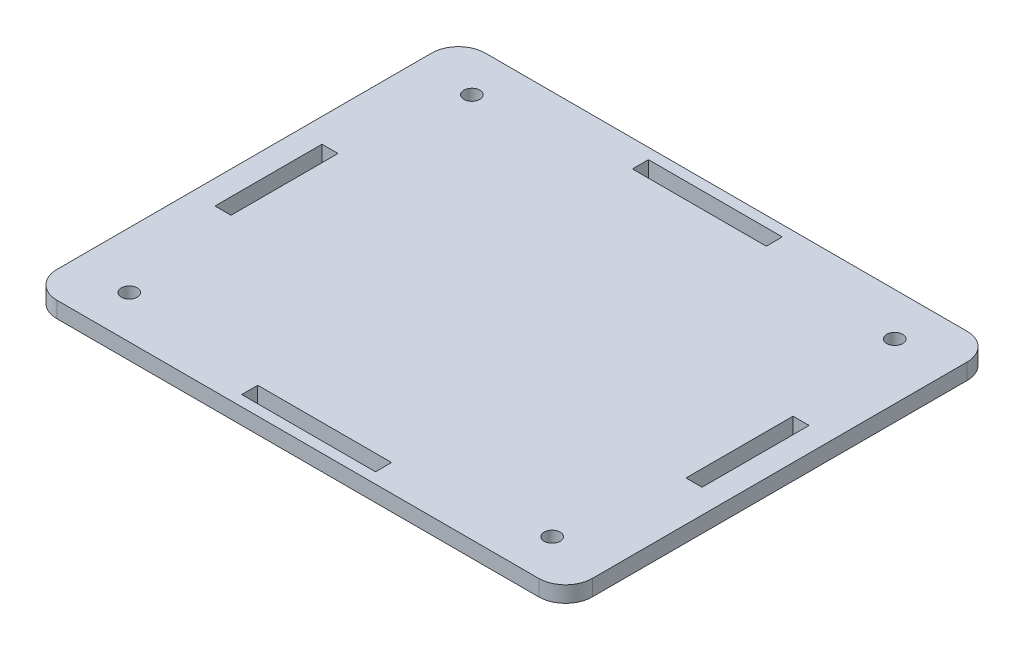
ISO-10303-21;
HEADER;
FILE_DESCRIPTION(('STEP AP214'),'2;1');
FILE_NAME('part.step','',(''),(''),'','','');
FILE_SCHEMA(('AUTOMOTIVE_DESIGN { 1 0 10303 214 1 1 1 1 }'));
ENDSEC;
DATA;
#1=APPLICATION_CONTEXT('core data for automotive mechanical design processes');
#2=APPLICATION_PROTOCOL_DEFINITION('international standard','automotive_design',2000,#1);
#3=PRODUCT_CONTEXT('',#1,'mechanical');
#4=PRODUCT('Part','Part','',(#3));
#5=PRODUCT_RELATED_PRODUCT_CATEGORY('part','',(#4));
#6=PRODUCT_DEFINITION_FORMATION('','',#4);
#7=PRODUCT_DEFINITION_CONTEXT('part definition',#1,'design');
#8=PRODUCT_DEFINITION('design','',#6,#7);
#9=PRODUCT_DEFINITION_SHAPE('','',#8);
#10=(LENGTH_UNIT() NAMED_UNIT(*) SI_UNIT(.MILLI.,.METRE.));
#11=(NAMED_UNIT(*) PLANE_ANGLE_UNIT() SI_UNIT($,.RADIAN.));
#12=(NAMED_UNIT(*) SI_UNIT($,.STERADIAN.) SOLID_ANGLE_UNIT());
#13=UNCERTAINTY_MEASURE_WITH_UNIT(LENGTH_MEASURE(1.E-05),#10,'distance_accuracy_value','');
#14=(GEOMETRIC_REPRESENTATION_CONTEXT(3) GLOBAL_UNCERTAINTY_ASSIGNED_CONTEXT((#13)) GLOBAL_UNIT_ASSIGNED_CONTEXT((#10,
#11,#12)) REPRESENTATION_CONTEXT('',''));
#15=CARTESIAN_POINT('',(0.,0.,0.));
#16=DIRECTION('',(0.,0.,1.));
#17=DIRECTION('',(1.,0.,0.));
#18=AXIS2_PLACEMENT_3D('',#15,#16,#17);
#19=CARTESIAN_POINT('',(50.,3.,-40.));
#20=DIRECTION('',(-1.,0.,0.));
#21=DIRECTION('',(0.,0.,1.));
#22=AXIS2_PLACEMENT_3D('',#19,#20,#21);
#23=PLANE('',#22);
#24=DIRECTION('',(0.,0.,-1.));
#25=VECTOR('',#24,1.);
#26=CARTESIAN_POINT('',(50.,3.,-40.));
#27=LINE('',#26,#25);
#28=CARTESIAN_POINT('',(50.,3.,35.));
#29=VERTEX_POINT('',#28);
#30=CARTESIAN_POINT('',(50.,3.,-35.));
#31=VERTEX_POINT('',#30);
#32=EDGE_CURVE('E307',#29,#31,#27,.T.);
#33=ORIENTED_EDGE('',*,*,#32,.F.);
#34=DIRECTION('',(0.,-1.,0.));
#35=VECTOR('',#34,1.);
#36=CARTESIAN_POINT('',(50.,3.,35.));
#37=LINE('',#36,#35);
#38=CARTESIAN_POINT('',(50.,0.,35.));
#39=VERTEX_POINT('',#38);
#40=EDGE_CURVE('E363',#29,#39,#37,.T.);
#41=ORIENTED_EDGE('',*,*,#40,.T.);
#42=DIRECTION('',(0.,0.,-1.));
#43=VECTOR('',#42,1.);
#44=CARTESIAN_POINT('',(50.,0.,-40.));
#45=LINE('',#44,#43);
#46=CARTESIAN_POINT('',(50.,0.,-35.));
#47=VERTEX_POINT('',#46);
#48=EDGE_CURVE('E304',#39,#47,#45,.T.);
#49=ORIENTED_EDGE('',*,*,#48,.T.);
#50=DIRECTION('',(0.,-1.,0.));
#51=VECTOR('',#50,1.);
#52=CARTESIAN_POINT('',(50.,3.,-35.));
#53=LINE('',#52,#51);
#54=EDGE_CURVE('E361',#47,#31,#53,.F.);
#55=ORIENTED_EDGE('',*,*,#54,.T.);
#56=EDGE_LOOP('',(#33,#41,#49,#55));
#57=FACE_BOUND('',#56,.T.);
#58=ADVANCED_FACE('F33',(#57),#23,.F.);
#59=CARTESIAN_POINT('',(-50.,3.,-40.));
#60=DIRECTION('',(0.,0.,1.));
#61=DIRECTION('',(1.,0.,0.));
#62=AXIS2_PLACEMENT_3D('',#59,#60,#61);
#63=PLANE('',#62);
#64=DIRECTION('',(-1.,0.,0.));
#65=VECTOR('',#64,1.);
#66=CARTESIAN_POINT('',(-50.,0.,-40.));
#67=LINE('',#66,#65);
#68=CARTESIAN_POINT('',(45.,0.,-40.));
#69=VERTEX_POINT('',#68);
#70=CARTESIAN_POINT('',(-45.,0.,-40.));
#71=VERTEX_POINT('',#70);
#72=EDGE_CURVE('E323',#69,#71,#67,.T.);
#73=ORIENTED_EDGE('',*,*,#72,.T.);
#74=DIRECTION('',(0.,-1.,0.));
#75=VECTOR('',#74,1.);
#76=CARTESIAN_POINT('',(-45.,3.,-40.));
#77=LINE('',#76,#75);
#78=CARTESIAN_POINT('',(-45.,3.,-40.));
#79=VERTEX_POINT('',#78);
#80=EDGE_CURVE('E346',#71,#79,#77,.F.);
#81=ORIENTED_EDGE('',*,*,#80,.T.);
#82=DIRECTION('',(-1.,0.,0.));
#83=VECTOR('',#82,1.);
#84=CARTESIAN_POINT('',(-50.,3.,-40.));
#85=LINE('',#84,#83);
#86=CARTESIAN_POINT('',(45.,3.,-40.));
#87=VERTEX_POINT('',#86);
#88=EDGE_CURVE('E310',#87,#79,#85,.T.);
#89=ORIENTED_EDGE('',*,*,#88,.F.);
#90=DIRECTION('',(0.,-1.,0.));
#91=VECTOR('',#90,1.);
#92=CARTESIAN_POINT('',(45.,3.,-40.));
#93=LINE('',#92,#91);
#94=EDGE_CURVE('E343',#87,#69,#93,.T.);
#95=ORIENTED_EDGE('',*,*,#94,.T.);
#96=EDGE_LOOP('',(#73,#81,#89,#95));
#97=FACE_BOUND('',#96,.T.);
#98=ADVANCED_FACE('F426',(#97),#63,.F.);
#99=CARTESIAN_POINT('',(-50.,3.,-40.));
#100=DIRECTION('',(1.,0.,0.));
#101=DIRECTION('',(0.,0.,-1.));
#102=AXIS2_PLACEMENT_3D('',#99,#100,#101);
#103=PLANE('',#102);
#104=DIRECTION('',(0.,0.,1.));
#105=VECTOR('',#104,1.);
#106=CARTESIAN_POINT('',(-50.,3.,-40.));
#107=LINE('',#106,#105);
#108=CARTESIAN_POINT('',(-50.,3.,-35.));
#109=VERTEX_POINT('',#108);
#110=CARTESIAN_POINT('',(-50.,3.,35.));
#111=VERTEX_POINT('',#110);
#112=EDGE_CURVE('E314',#109,#111,#107,.T.);
#113=ORIENTED_EDGE('',*,*,#112,.F.);
#114=DIRECTION('',(0.,-1.,0.));
#115=VECTOR('',#114,1.);
#116=CARTESIAN_POINT('',(-50.,3.,-35.));
#117=LINE('',#116,#115);
#118=CARTESIAN_POINT('',(-50.,0.,-35.));
#119=VERTEX_POINT('',#118);
#120=EDGE_CURVE('E332',#109,#119,#117,.T.);
#121=ORIENTED_EDGE('',*,*,#120,.T.);
#122=DIRECTION('',(0.,0.,1.));
#123=VECTOR('',#122,1.);
#124=CARTESIAN_POINT('',(-50.,0.,-40.));
#125=LINE('',#124,#123);
#126=CARTESIAN_POINT('',(-50.,0.,35.));
#127=VERTEX_POINT('',#126);
#128=EDGE_CURVE('E326',#119,#127,#125,.T.);
#129=ORIENTED_EDGE('',*,*,#128,.T.);
#130=DIRECTION('',(0.,-1.,0.));
#131=VECTOR('',#130,1.);
#132=CARTESIAN_POINT('',(-50.,3.,35.));
#133=LINE('',#132,#131);
#134=EDGE_CURVE('E320',#127,#111,#133,.F.);
#135=ORIENTED_EDGE('',*,*,#134,.T.);
#136=EDGE_LOOP('',(#113,#121,#129,#135));
#137=FACE_BOUND('',#136,.T.);
#138=ADVANCED_FACE('F432',(#137),#103,.F.);
#139=CARTESIAN_POINT('',(-50.,3.,40.));
#140=DIRECTION('',(0.,0.,-1.));
#141=DIRECTION('',(-1.,0.,0.));
#142=AXIS2_PLACEMENT_3D('',#139,#140,#141);
#143=PLANE('',#142);
#144=DIRECTION('',(1.,0.,0.));
#145=VECTOR('',#144,1.);
#146=CARTESIAN_POINT('',(-50.,3.,40.));
#147=LINE('',#146,#145);
#148=CARTESIAN_POINT('',(-45.,3.,40.));
#149=VERTEX_POINT('',#148);
#150=CARTESIAN_POINT('',(45.,3.,40.));
#151=VERTEX_POINT('',#150);
#152=EDGE_CURVE('E317',#149,#151,#147,.T.);
#153=ORIENTED_EDGE('',*,*,#152,.F.);
#154=DIRECTION('',(0.,-1.,0.));
#155=VECTOR('',#154,1.);
#156=CARTESIAN_POINT('',(-45.,3.,40.));
#157=LINE('',#156,#155);
#158=CARTESIAN_POINT('',(-45.,0.,40.));
#159=VERTEX_POINT('',#158);
#160=EDGE_CURVE('E358',#149,#159,#157,.T.);
#161=ORIENTED_EDGE('',*,*,#160,.T.);
#162=DIRECTION('',(1.,0.,0.));
#163=VECTOR('',#162,1.);
#164=CARTESIAN_POINT('',(-50.,0.,40.));
#165=LINE('',#164,#163);
#166=CARTESIAN_POINT('',(45.,0.,40.));
#167=VERTEX_POINT('',#166);
#168=EDGE_CURVE('E311',#159,#167,#165,.T.);
#169=ORIENTED_EDGE('',*,*,#168,.T.);
#170=DIRECTION('',(0.,-1.,0.));
#171=VECTOR('',#170,1.);
#172=CARTESIAN_POINT('',(45.,3.,40.));
#173=LINE('',#172,#171);
#174=EDGE_CURVE('E356',#167,#151,#173,.F.);
#175=ORIENTED_EDGE('',*,*,#174,.T.);
#176=EDGE_LOOP('',(#153,#161,#169,#175));
#177=FACE_BOUND('',#176,.T.);
#178=ADVANCED_FACE('F474',(#177),#143,.F.);
#179=CARTESIAN_POINT('',(0.,3.,0.));
#180=DIRECTION('',(0.,1.,0.));
#181=DIRECTION('',(0.,0.,1.));
#182=AXIS2_PLACEMENT_3D('',#179,#180,#181);
#183=PLANE('',#182);
#184=DIRECTION('',(0.,0.,1.));
#185=VECTOR('',#184,1.);
#186=CARTESIAN_POINT('',(-45.5,3.,-10.));
#187=LINE('',#186,#185);
#188=CARTESIAN_POINT('',(-45.5,3.,-10.));
#189=VERTEX_POINT('',#188);
#190=CARTESIAN_POINT('',(-45.5,3.,10.));
#191=VERTEX_POINT('',#190);
#192=EDGE_CURVE('E48',#189,#191,#187,.T.);
#193=ORIENTED_EDGE('',*,*,#192,.F.);
#194=DIRECTION('',(-1.,0.,0.));
#195=VECTOR('',#194,1.);
#196=CARTESIAN_POINT('',(-42.5,3.,-10.));
#197=LINE('',#196,#195);
#198=CARTESIAN_POINT('',(-42.5,3.,-10.));
#199=VERTEX_POINT('',#198);
#200=EDGE_CURVE('E213',#199,#189,#197,.T.);
#201=ORIENTED_EDGE('',*,*,#200,.F.);
#202=DIRECTION('',(0.,0.,-1.));
#203=VECTOR('',#202,1.);
#204=CARTESIAN_POINT('',(-42.5,3.,-10.));
#205=LINE('',#204,#203);
#206=CARTESIAN_POINT('',(-42.5,3.,10.));
#207=VERTEX_POINT('',#206);
#208=EDGE_CURVE('E197',#207,#199,#205,.T.);
#209=ORIENTED_EDGE('',*,*,#208,.F.);
#210=DIRECTION('',(1.,0.,0.));
#211=VECTOR('',#210,1.);
#212=CARTESIAN_POINT('',(-42.5,3.,10.));
#213=LINE('',#212,#211);
#214=EDGE_CURVE('E206',#191,#207,#213,.T.);
#215=ORIENTED_EDGE('',*,*,#214,.F.);
#216=EDGE_LOOP('',(#193,#201,#209,#215));
#217=FACE_BOUND('',#216,.T.);
#218=DIRECTION('',(0.,0.,1.));
#219=VECTOR('',#218,1.);
#220=CARTESIAN_POINT('',(42.5,3.,-10.));
#221=LINE('',#220,#219);
#222=CARTESIAN_POINT('',(42.5,3.,-10.));
#223=VERTEX_POINT('',#222);
#224=CARTESIAN_POINT('',(42.5,3.,10.));
#225=VERTEX_POINT('',#224);
#226=EDGE_CURVE('E220',#223,#225,#221,.T.);
#227=ORIENTED_EDGE('',*,*,#226,.F.);
#228=DIRECTION('',(-1.,0.,0.));
#229=VECTOR('',#228,1.);
#230=CARTESIAN_POINT('',(45.5,3.,-10.));
#231=LINE('',#230,#229);
#232=CARTESIAN_POINT('',(45.5,3.,-10.));
#233=VERTEX_POINT('',#232);
#234=EDGE_CURVE('E230',#233,#223,#231,.T.);
#235=ORIENTED_EDGE('',*,*,#234,.F.);
#236=DIRECTION('',(0.,0.,-1.));
#237=VECTOR('',#236,1.);
#238=CARTESIAN_POINT('',(45.5,3.,-10.));
#239=LINE('',#238,#237);
#240=CARTESIAN_POINT('',(45.5,3.,10.));
#241=VERTEX_POINT('',#240);
#242=EDGE_CURVE('E227',#241,#233,#239,.T.);
#243=ORIENTED_EDGE('',*,*,#242,.F.);
#244=DIRECTION('',(1.,0.,0.));
#245=VECTOR('',#244,1.);
#246=CARTESIAN_POINT('',(45.5,3.,10.));
#247=LINE('',#246,#245);
#248=EDGE_CURVE('E224',#225,#241,#247,.T.);
#249=ORIENTED_EDGE('',*,*,#248,.F.);
#250=EDGE_LOOP('',(#227,#235,#243,#249));
#251=FACE_BOUND('',#250,.T.);
#252=DIRECTION('',(0.,0.,1.));
#253=VECTOR('',#252,1.);
#254=CARTESIAN_POINT('',(-12.5,3.,-38.));
#255=LINE('',#254,#253);
#256=CARTESIAN_POINT('',(-12.5,3.,-38.));
#257=VERTEX_POINT('',#256);
#258=CARTESIAN_POINT('',(-12.5,3.,-35.));
#259=VERTEX_POINT('',#258);
#260=EDGE_CURVE('E236',#257,#259,#255,.T.);
#261=ORIENTED_EDGE('',*,*,#260,.F.);
#262=DIRECTION('',(-1.,0.,0.));
#263=VECTOR('',#262,1.);
#264=CARTESIAN_POINT('',(12.5,3.,-38.));
#265=LINE('',#264,#263);
#266=CARTESIAN_POINT('',(12.5,3.,-38.));
#267=VERTEX_POINT('',#266);
#268=EDGE_CURVE('E250',#267,#257,#265,.T.);
#269=ORIENTED_EDGE('',*,*,#268,.F.);
#270=DIRECTION('',(0.,0.,-1.));
#271=VECTOR('',#270,1.);
#272=CARTESIAN_POINT('',(12.5,3.,-38.));
#273=LINE('',#272,#271);
#274=CARTESIAN_POINT('',(12.5,3.,-35.));
#275=VERTEX_POINT('',#274);
#276=EDGE_CURVE('E247',#275,#267,#273,.T.);
#277=ORIENTED_EDGE('',*,*,#276,.F.);
#278=DIRECTION('',(1.,0.,0.));
#279=VECTOR('',#278,1.);
#280=CARTESIAN_POINT('',(12.5,3.,-35.));
#281=LINE('',#280,#279);
#282=EDGE_CURVE('E244',#259,#275,#281,.T.);
#283=ORIENTED_EDGE('',*,*,#282,.F.);
#284=EDGE_LOOP('',(#261,#269,#277,#283));
#285=FACE_BOUND('',#284,.T.);
#286=DIRECTION('',(0.,0.,1.));
#287=VECTOR('',#286,1.);
#288=CARTESIAN_POINT('',(-12.5,3.,35.));
#289=LINE('',#288,#287);
#290=CARTESIAN_POINT('',(-12.5,3.,35.));
#291=VERTEX_POINT('',#290);
#292=CARTESIAN_POINT('',(-12.5,3.,38.));
#293=VERTEX_POINT('',#292);
#294=EDGE_CURVE('E256',#291,#293,#289,.T.);
#295=ORIENTED_EDGE('',*,*,#294,.F.);
#296=DIRECTION('',(-1.,0.,0.));
#297=VECTOR('',#296,1.);
#298=CARTESIAN_POINT('',(12.5,3.,35.));
#299=LINE('',#298,#297);
#300=CARTESIAN_POINT('',(12.5,3.,35.));
#301=VERTEX_POINT('',#300);
#302=EDGE_CURVE('E270',#301,#291,#299,.T.);
#303=ORIENTED_EDGE('',*,*,#302,.F.);
#304=DIRECTION('',(0.,0.,-1.));
#305=VECTOR('',#304,1.);
#306=CARTESIAN_POINT('',(12.5,3.,35.));
#307=LINE('',#306,#305);
#308=CARTESIAN_POINT('',(12.5,3.,38.));
#309=VERTEX_POINT('',#308);
#310=EDGE_CURVE('E267',#309,#301,#307,.T.);
#311=ORIENTED_EDGE('',*,*,#310,.F.);
#312=DIRECTION('',(1.,0.,0.));
#313=VECTOR('',#312,1.);
#314=CARTESIAN_POINT('',(12.5,3.,38.));
#315=LINE('',#314,#313);
#316=EDGE_CURVE('E264',#293,#309,#315,.T.);
#317=ORIENTED_EDGE('',*,*,#316,.F.);
#318=EDGE_LOOP('',(#295,#303,#311,#317));
#319=FACE_BOUND('',#318,.T.);
#320=CARTESIAN_POINT('',(-39.5,3.,32.));
#321=DIRECTION('',(0.,1.,0.));
#322=DIRECTION('',(0.,0.,1.));
#323=AXIS2_PLACEMENT_3D('',#320,#321,#322);
#324=CIRCLE('',#323,1.5);
#325=CARTESIAN_POINT('',(-39.5,3.,33.5));
#326=VERTEX_POINT('',#325);
#327=EDGE_CURVE('E276',#326,#326,#324,.T.);
#328=ORIENTED_EDGE('',*,*,#327,.F.);
#329=EDGE_LOOP('',(#328));
#330=FACE_BOUND('',#329,.T.);
#331=CARTESIAN_POINT('',(-39.5,3.,-32.));
#332=DIRECTION('',(0.,1.,0.));
#333=DIRECTION('',(0.,0.,1.));
#334=AXIS2_PLACEMENT_3D('',#331,#332,#333);
#335=CIRCLE('',#334,1.5);
#336=CARTESIAN_POINT('',(-39.5,3.,-30.5));
#337=VERTEX_POINT('',#336);
#338=EDGE_CURVE('E286',#337,#337,#335,.T.);
#339=ORIENTED_EDGE('',*,*,#338,.F.);
#340=EDGE_LOOP('',(#339));
#341=FACE_BOUND('',#340,.T.);
#342=CARTESIAN_POINT('',(39.5,3.,-32.));
#343=DIRECTION('',(0.,1.,0.));
#344=DIRECTION('',(0.,0.,1.));
#345=AXIS2_PLACEMENT_3D('',#342,#343,#344);
#346=CIRCLE('',#345,1.5);
#347=CARTESIAN_POINT('',(39.5,3.,-30.5));
#348=VERTEX_POINT('',#347);
#349=EDGE_CURVE('E292',#348,#348,#346,.T.);
#350=ORIENTED_EDGE('',*,*,#349,.F.);
#351=EDGE_LOOP('',(#350));
#352=FACE_BOUND('',#351,.T.);
#353=CARTESIAN_POINT('',(39.5,3.,32.));
#354=DIRECTION('',(0.,1.,0.));
#355=DIRECTION('',(0.,0.,1.));
#356=AXIS2_PLACEMENT_3D('',#353,#354,#355);
#357=CIRCLE('',#356,1.5);
#358=CARTESIAN_POINT('',(39.5,3.,33.5));
#359=VERTEX_POINT('',#358);
#360=EDGE_CURVE('E298',#359,#359,#357,.T.);
#361=ORIENTED_EDGE('',*,*,#360,.F.);
#362=EDGE_LOOP('',(#361));
#363=FACE_BOUND('',#362,.T.);
#364=ORIENTED_EDGE('',*,*,#88,.T.);
#365=CARTESIAN_POINT('',(-45.,3.,-35.));
#366=DIRECTION('',(0.,1.,0.));
#367=DIRECTION('',(0.,0.,1.));
#368=AXIS2_PLACEMENT_3D('',#365,#366,#367);
#369=CIRCLE('',#368,5.);
#370=EDGE_CURVE('E354',#79,#109,#369,.T.);
#371=ORIENTED_EDGE('',*,*,#370,.T.);
#372=ORIENTED_EDGE('',*,*,#112,.T.);
#373=CARTESIAN_POINT('',(-45.,3.,35.));
#374=DIRECTION('',(0.,1.,0.));
#375=DIRECTION('',(0.,0.,1.));
#376=AXIS2_PLACEMENT_3D('',#373,#374,#375);
#377=CIRCLE('',#376,5.);
#378=EDGE_CURVE('E352',#111,#149,#377,.T.);
#379=ORIENTED_EDGE('',*,*,#378,.T.);
#380=ORIENTED_EDGE('',*,*,#152,.T.);
#381=CARTESIAN_POINT('',(45.,3.,35.));
#382=DIRECTION('',(0.,1.,0.));
#383=DIRECTION('',(0.,0.,1.));
#384=AXIS2_PLACEMENT_3D('',#381,#382,#383);
#385=CIRCLE('',#384,5.);
#386=EDGE_CURVE('E350',#151,#29,#385,.T.);
#387=ORIENTED_EDGE('',*,*,#386,.T.);
#388=ORIENTED_EDGE('',*,*,#32,.T.);
#389=CARTESIAN_POINT('',(45.,3.,-35.));
#390=DIRECTION('',(0.,1.,0.));
#391=DIRECTION('',(0.,0.,1.));
#392=AXIS2_PLACEMENT_3D('',#389,#390,#391);
#393=CIRCLE('',#392,5.);
#394=EDGE_CURVE('E348',#31,#87,#393,.T.);
#395=ORIENTED_EDGE('',*,*,#394,.T.);
#396=EDGE_LOOP('',(#364,#371,#372,#379,#380,#387,#388,#395));
#397=FACE_BOUND('',#396,.T.);
#398=ADVANCED_FACE('F210',(#217,#251,#285,#319,#330,#341,#352,#363,#397),#183,.T.);
#399=CARTESIAN_POINT('',(0.,0.,0.));
#400=DIRECTION('',(0.,1.,0.));
#401=DIRECTION('',(0.,0.,1.));
#402=AXIS2_PLACEMENT_3D('',#399,#400,#401);
#403=PLANE('',#402);
#404=DIRECTION('',(-1.,0.,0.));
#405=VECTOR('',#404,1.);
#406=CARTESIAN_POINT('',(0.,0.,-10.));
#407=LINE('',#406,#405);
#408=CARTESIAN_POINT('',(-42.5,0.,-10.));
#409=VERTEX_POINT('',#408);
#410=CARTESIAN_POINT('',(-45.5,0.,-10.));
#411=VERTEX_POINT('',#410);
#412=EDGE_CURVE('E41',#409,#411,#407,.T.);
#413=ORIENTED_EDGE('',*,*,#412,.T.);
#414=DIRECTION('',(0.,0.,1.));
#415=VECTOR('',#414,1.);
#416=CARTESIAN_POINT('',(-45.5,0.,0.));
#417=LINE('',#416,#415);
#418=CARTESIAN_POINT('',(-45.5,0.,10.));
#419=VERTEX_POINT('',#418);
#420=EDGE_CURVE('E11',#411,#419,#417,.T.);
#421=ORIENTED_EDGE('',*,*,#420,.T.);
#422=DIRECTION('',(1.,0.,0.));
#423=VECTOR('',#422,1.);
#424=CARTESIAN_POINT('',(0.,0.,10.));
#425=LINE('',#424,#423);
#426=CARTESIAN_POINT('',(-42.5,0.,10.));
#427=VERTEX_POINT('',#426);
#428=EDGE_CURVE('E402',#419,#427,#425,.T.);
#429=ORIENTED_EDGE('',*,*,#428,.T.);
#430=DIRECTION('',(0.,0.,-1.));
#431=VECTOR('',#430,1.);
#432=CARTESIAN_POINT('',(-42.5,0.,0.));
#433=LINE('',#432,#431);
#434=EDGE_CURVE('E200',#427,#409,#433,.T.);
#435=ORIENTED_EDGE('',*,*,#434,.T.);
#436=EDGE_LOOP('',(#413,#421,#429,#435));
#437=FACE_BOUND('',#436,.T.);
#438=DIRECTION('',(-1.,0.,0.));
#439=VECTOR('',#438,1.);
#440=CARTESIAN_POINT('',(0.,0.,-10.));
#441=LINE('',#440,#439);
#442=CARTESIAN_POINT('',(45.5,0.,-10.));
#443=VERTEX_POINT('',#442);
#444=CARTESIAN_POINT('',(42.5,0.,-10.));
#445=VERTEX_POINT('',#444);
#446=EDGE_CURVE('E396',#443,#445,#441,.T.);
#447=ORIENTED_EDGE('',*,*,#446,.T.);
#448=DIRECTION('',(0.,0.,1.));
#449=VECTOR('',#448,1.);
#450=CARTESIAN_POINT('',(42.5,0.,0.));
#451=LINE('',#450,#449);
#452=CARTESIAN_POINT('',(42.5,0.,10.));
#453=VERTEX_POINT('',#452);
#454=EDGE_CURVE('E399',#445,#453,#451,.T.);
#455=ORIENTED_EDGE('',*,*,#454,.T.);
#456=DIRECTION('',(1.,0.,0.));
#457=VECTOR('',#456,1.);
#458=CARTESIAN_POINT('',(0.,0.,9.99999999999995));
#459=LINE('',#458,#457);
#460=CARTESIAN_POINT('',(45.5,0.,10.));
#461=VERTEX_POINT('',#460);
#462=EDGE_CURVE('E390',#453,#461,#459,.T.);
#463=ORIENTED_EDGE('',*,*,#462,.T.);
#464=DIRECTION('',(0.,0.,-1.));
#465=VECTOR('',#464,1.);
#466=CARTESIAN_POINT('',(45.5,0.,0.));
#467=LINE('',#466,#465);
#468=EDGE_CURVE('E393',#461,#443,#467,.T.);
#469=ORIENTED_EDGE('',*,*,#468,.T.);
#470=EDGE_LOOP('',(#447,#455,#463,#469));
#471=FACE_BOUND('',#470,.T.);
#472=DIRECTION('',(-1.,0.,0.));
#473=VECTOR('',#472,1.);
#474=CARTESIAN_POINT('',(0.,0.,-38.));
#475=LINE('',#474,#473);
#476=CARTESIAN_POINT('',(12.5,0.,-38.));
#477=VERTEX_POINT('',#476);
#478=CARTESIAN_POINT('',(-12.5,0.,-38.));
#479=VERTEX_POINT('',#478);
#480=EDGE_CURVE('E384',#477,#479,#475,.T.);
#481=ORIENTED_EDGE('',*,*,#480,.T.);
#482=DIRECTION('',(0.,0.,1.));
#483=VECTOR('',#482,1.);
#484=CARTESIAN_POINT('',(-12.5,0.,0.));
#485=LINE('',#484,#483);
#486=CARTESIAN_POINT('',(-12.5,0.,-35.));
#487=VERTEX_POINT('',#486);
#488=EDGE_CURVE('E387',#479,#487,#485,.T.);
#489=ORIENTED_EDGE('',*,*,#488,.T.);
#490=DIRECTION('',(1.,0.,0.));
#491=VECTOR('',#490,1.);
#492=CARTESIAN_POINT('',(0.,0.,-35.));
#493=LINE('',#492,#491);
#494=CARTESIAN_POINT('',(12.5,0.,-35.));
#495=VERTEX_POINT('',#494);
#496=EDGE_CURVE('E378',#487,#495,#493,.T.);
#497=ORIENTED_EDGE('',*,*,#496,.T.);
#498=DIRECTION('',(0.,0.,-1.));
#499=VECTOR('',#498,1.);
#500=CARTESIAN_POINT('',(12.5,0.,0.));
#501=LINE('',#500,#499);
#502=EDGE_CURVE('E381',#495,#477,#501,.T.);
#503=ORIENTED_EDGE('',*,*,#502,.T.);
#504=EDGE_LOOP('',(#481,#489,#497,#503));
#505=FACE_BOUND('',#504,.T.);
#506=DIRECTION('',(-1.,0.,0.));
#507=VECTOR('',#506,1.);
#508=CARTESIAN_POINT('',(0.,0.,35.));
#509=LINE('',#508,#507);
#510=CARTESIAN_POINT('',(12.5,0.,35.));
#511=VERTEX_POINT('',#510);
#512=CARTESIAN_POINT('',(-12.5,0.,35.));
#513=VERTEX_POINT('',#512);
#514=EDGE_CURVE('E372',#511,#513,#509,.T.);
#515=ORIENTED_EDGE('',*,*,#514,.T.);
#516=DIRECTION('',(0.,0.,1.));
#517=VECTOR('',#516,1.);
#518=CARTESIAN_POINT('',(-12.5,0.,0.));
#519=LINE('',#518,#517);
#520=CARTESIAN_POINT('',(-12.5,0.,38.));
#521=VERTEX_POINT('',#520);
#522=EDGE_CURVE('E375',#513,#521,#519,.T.);
#523=ORIENTED_EDGE('',*,*,#522,.T.);
#524=DIRECTION('',(1.,0.,0.));
#525=VECTOR('',#524,1.);
#526=CARTESIAN_POINT('',(0.,0.,38.));
#527=LINE('',#526,#525);
#528=CARTESIAN_POINT('',(12.5,0.,38.));
#529=VERTEX_POINT('',#528);
#530=EDGE_CURVE('E366',#521,#529,#527,.T.);
#531=ORIENTED_EDGE('',*,*,#530,.T.);
#532=DIRECTION('',(0.,0.,-1.));
#533=VECTOR('',#532,1.);
#534=CARTESIAN_POINT('',(12.5,0.,0.));
#535=LINE('',#534,#533);
#536=EDGE_CURVE('E369',#529,#511,#535,.T.);
#537=ORIENTED_EDGE('',*,*,#536,.T.);
#538=EDGE_LOOP('',(#515,#523,#531,#537));
#539=FACE_BOUND('',#538,.T.);
#540=CARTESIAN_POINT('',(-39.5,0.,32.));
#541=DIRECTION('',(0.,1.,0.));
#542=DIRECTION('',(0.,0.,1.));
#543=AXIS2_PLACEMENT_3D('',#540,#541,#542);
#544=CIRCLE('',#543,1.5);
#545=CARTESIAN_POINT('',(-39.5,0.,33.5));
#546=VERTEX_POINT('',#545);
#547=EDGE_CURVE('E283',#546,#546,#544,.T.);
#548=ORIENTED_EDGE('',*,*,#547,.T.);
#549=EDGE_LOOP('',(#548));
#550=FACE_BOUND('',#549,.T.);
#551=CARTESIAN_POINT('',(-39.5,0.,-32.));
#552=DIRECTION('',(0.,1.,0.));
#553=DIRECTION('',(0.,0.,1.));
#554=AXIS2_PLACEMENT_3D('',#551,#552,#553);
#555=CIRCLE('',#554,1.5);
#556=CARTESIAN_POINT('',(-39.5,0.,-30.5));
#557=VERTEX_POINT('',#556);
#558=EDGE_CURVE('E289',#557,#557,#555,.T.);
#559=ORIENTED_EDGE('',*,*,#558,.T.);
#560=EDGE_LOOP('',(#559));
#561=FACE_BOUND('',#560,.T.);
#562=CARTESIAN_POINT('',(39.5,0.,-32.));
#563=DIRECTION('',(0.,1.,0.));
#564=DIRECTION('',(0.,0.,1.));
#565=AXIS2_PLACEMENT_3D('',#562,#563,#564);
#566=CIRCLE('',#565,1.5);
#567=CARTESIAN_POINT('',(39.5,0.,-30.5));
#568=VERTEX_POINT('',#567);
#569=EDGE_CURVE('E295',#568,#568,#566,.T.);
#570=ORIENTED_EDGE('',*,*,#569,.T.);
#571=EDGE_LOOP('',(#570));
#572=FACE_BOUND('',#571,.T.);
#573=CARTESIAN_POINT('',(39.5,0.,32.));
#574=DIRECTION('',(0.,1.,0.));
#575=DIRECTION('',(0.,0.,1.));
#576=AXIS2_PLACEMENT_3D('',#573,#574,#575);
#577=CIRCLE('',#576,1.5);
#578=CARTESIAN_POINT('',(39.5,0.,33.5));
#579=VERTEX_POINT('',#578);
#580=EDGE_CURVE('E301',#579,#579,#577,.T.);
#581=ORIENTED_EDGE('',*,*,#580,.T.);
#582=EDGE_LOOP('',(#581));
#583=FACE_BOUND('',#582,.T.);
#584=ORIENTED_EDGE('',*,*,#128,.F.);
#585=CARTESIAN_POINT('',(-45.,0.,-35.));
#586=DIRECTION('',(0.,1.,0.));
#587=DIRECTION('',(0.,0.,1.));
#588=AXIS2_PLACEMENT_3D('',#585,#586,#587);
#589=CIRCLE('',#588,5.);
#590=EDGE_CURVE('E341',#119,#71,#589,.F.);
#591=ORIENTED_EDGE('',*,*,#590,.T.);
#592=ORIENTED_EDGE('',*,*,#72,.F.);
#593=CARTESIAN_POINT('',(45.,0.,-35.));
#594=DIRECTION('',(0.,1.,0.));
#595=DIRECTION('',(0.,0.,1.));
#596=AXIS2_PLACEMENT_3D('',#593,#594,#595);
#597=CIRCLE('',#596,5.);
#598=EDGE_CURVE('E335',#69,#47,#597,.F.);
#599=ORIENTED_EDGE('',*,*,#598,.T.);
#600=ORIENTED_EDGE('',*,*,#48,.F.);
#601=CARTESIAN_POINT('',(45.,0.,35.));
#602=DIRECTION('',(0.,1.,0.));
#603=DIRECTION('',(0.,0.,1.));
#604=AXIS2_PLACEMENT_3D('',#601,#602,#603);
#605=CIRCLE('',#604,5.);
#606=EDGE_CURVE('E337',#39,#167,#605,.F.);
#607=ORIENTED_EDGE('',*,*,#606,.T.);
#608=ORIENTED_EDGE('',*,*,#168,.F.);
#609=CARTESIAN_POINT('',(-45.,0.,35.));
#610=DIRECTION('',(0.,1.,0.));
#611=DIRECTION('',(0.,0.,1.));
#612=AXIS2_PLACEMENT_3D('',#609,#610,#611);
#613=CIRCLE('',#612,5.);
#614=EDGE_CURVE('E339',#159,#127,#613,.F.);
#615=ORIENTED_EDGE('',*,*,#614,.T.);
#616=EDGE_LOOP('',(#584,#591,#592,#599,#600,#607,#608,#615));
#617=FACE_BOUND('',#616,.T.);
#618=ADVANCED_FACE('F406',(#437,#471,#505,#539,#550,#561,#572,#583,#617),#403,.F.);
#619=CARTESIAN_POINT('',(-45.,3.,-35.));
#620=DIRECTION('',(0.,-1.,0.));
#621=DIRECTION('',(0.,0.,-1.));
#622=AXIS2_PLACEMENT_3D('',#619,#620,#621);
#623=CYLINDRICAL_SURFACE('',#622,5.);
#624=ORIENTED_EDGE('',*,*,#370,.F.);
#625=ORIENTED_EDGE('',*,*,#80,.F.);
#626=ORIENTED_EDGE('',*,*,#590,.F.);
#627=ORIENTED_EDGE('',*,*,#120,.F.);
#628=EDGE_LOOP('',(#624,#625,#626,#627));
#629=FACE_BOUND('',#628,.T.);
#630=ADVANCED_FACE('F438',(#629),#623,.T.);
#631=CARTESIAN_POINT('',(-45.,3.,35.));
#632=DIRECTION('',(0.,-1.,0.));
#633=DIRECTION('',(0.,0.,-1.));
#634=AXIS2_PLACEMENT_3D('',#631,#632,#633);
#635=CYLINDRICAL_SURFACE('',#634,5.);
#636=ORIENTED_EDGE('',*,*,#378,.F.);
#637=ORIENTED_EDGE('',*,*,#134,.F.);
#638=ORIENTED_EDGE('',*,*,#614,.F.);
#639=ORIENTED_EDGE('',*,*,#160,.F.);
#640=EDGE_LOOP('',(#636,#637,#638,#639));
#641=FACE_BOUND('',#640,.T.);
#642=ADVANCED_FACE('F441',(#641),#635,.T.);
#643=CARTESIAN_POINT('',(45.,3.,35.));
#644=DIRECTION('',(0.,-1.,0.));
#645=DIRECTION('',(0.,0.,-1.));
#646=AXIS2_PLACEMENT_3D('',#643,#644,#645);
#647=CYLINDRICAL_SURFACE('',#646,5.);
#648=ORIENTED_EDGE('',*,*,#386,.F.);
#649=ORIENTED_EDGE('',*,*,#174,.F.);
#650=ORIENTED_EDGE('',*,*,#606,.F.);
#651=ORIENTED_EDGE('',*,*,#40,.F.);
#652=EDGE_LOOP('',(#648,#649,#650,#651));
#653=FACE_BOUND('',#652,.T.);
#654=ADVANCED_FACE('F444',(#653),#647,.T.);
#655=CARTESIAN_POINT('',(45.,3.,-35.));
#656=DIRECTION('',(0.,-1.,0.));
#657=DIRECTION('',(0.,0.,-1.));
#658=AXIS2_PLACEMENT_3D('',#655,#656,#657);
#659=CYLINDRICAL_SURFACE('',#658,5.);
#660=ORIENTED_EDGE('',*,*,#394,.F.);
#661=ORIENTED_EDGE('',*,*,#54,.F.);
#662=ORIENTED_EDGE('',*,*,#598,.F.);
#663=ORIENTED_EDGE('',*,*,#94,.F.);
#664=EDGE_LOOP('',(#660,#661,#662,#663));
#665=FACE_BOUND('',#664,.T.);
#666=ADVANCED_FACE('F35',(#665),#659,.T.);
#667=CARTESIAN_POINT('',(39.5,0.,32.));
#668=DIRECTION('',(0.,1.,0.));
#669=DIRECTION('',(0.,0.,1.));
#670=AXIS2_PLACEMENT_3D('',#667,#668,#669);
#671=CYLINDRICAL_SURFACE('',#670,1.5);
#672=ORIENTED_EDGE('',*,*,#580,.F.);
#673=EDGE_LOOP('',(#672));
#674=FACE_BOUND('',#673,.T.);
#675=ORIENTED_EDGE('',*,*,#360,.T.);
#676=EDGE_LOOP('',(#675));
#677=FACE_BOUND('',#676,.T.);
#678=ADVANCED_FACE('F451',(#674,#677),#671,.F.);
#679=CARTESIAN_POINT('',(39.5,0.,-32.));
#680=DIRECTION('',(0.,1.,0.));
#681=DIRECTION('',(0.,0.,1.));
#682=AXIS2_PLACEMENT_3D('',#679,#680,#681);
#683=CYLINDRICAL_SURFACE('',#682,1.5);
#684=ORIENTED_EDGE('',*,*,#569,.F.);
#685=EDGE_LOOP('',(#684));
#686=FACE_BOUND('',#685,.T.);
#687=ORIENTED_EDGE('',*,*,#349,.T.);
#688=EDGE_LOOP('',(#687));
#689=FACE_BOUND('',#688,.T.);
#690=ADVANCED_FACE('F660',(#686,#689),#683,.F.);
#691=CARTESIAN_POINT('',(-39.5,0.,-32.));
#692=DIRECTION('',(0.,1.,0.));
#693=DIRECTION('',(0.,0.,1.));
#694=AXIS2_PLACEMENT_3D('',#691,#692,#693);
#695=CYLINDRICAL_SURFACE('',#694,1.5);
#696=ORIENTED_EDGE('',*,*,#558,.F.);
#697=EDGE_LOOP('',(#696));
#698=FACE_BOUND('',#697,.T.);
#699=ORIENTED_EDGE('',*,*,#338,.T.);
#700=EDGE_LOOP('',(#699));
#701=FACE_BOUND('',#700,.T.);
#702=ADVANCED_FACE('F656',(#698,#701),#695,.F.);
#703=CARTESIAN_POINT('',(-39.5,0.,32.));
#704=DIRECTION('',(0.,1.,0.));
#705=DIRECTION('',(0.,0.,1.));
#706=AXIS2_PLACEMENT_3D('',#703,#704,#705);
#707=CYLINDRICAL_SURFACE('',#706,1.5);
#708=ORIENTED_EDGE('',*,*,#547,.F.);
#709=EDGE_LOOP('',(#708));
#710=FACE_BOUND('',#709,.T.);
#711=ORIENTED_EDGE('',*,*,#327,.T.);
#712=EDGE_LOOP('',(#711));
#713=FACE_BOUND('',#712,.T.);
#714=ADVANCED_FACE('F506',(#710,#713),#707,.F.);
#715=CARTESIAN_POINT('',(-12.5,-7.,35.));
#716=DIRECTION('',(-1.,0.,0.));
#717=DIRECTION('',(0.,0.,1.));
#718=AXIS2_PLACEMENT_3D('',#715,#716,#717);
#719=PLANE('',#718);
#720=DIRECTION('',(0.,1.,0.));
#721=VECTOR('',#720,1.);
#722=CARTESIAN_POINT('',(-12.5,-7.,35.));
#723=LINE('',#722,#721);
#724=EDGE_CURVE('E274',#513,#291,#723,.T.);
#725=ORIENTED_EDGE('',*,*,#724,.T.);
#726=ORIENTED_EDGE('',*,*,#294,.T.);
#727=DIRECTION('',(0.,1.,0.));
#728=VECTOR('',#727,1.);
#729=CARTESIAN_POINT('',(-12.5,-7.,38.));
#730=LINE('',#729,#728);
#731=EDGE_CURVE('E273',#521,#293,#730,.T.);
#732=ORIENTED_EDGE('',*,*,#731,.F.);
#733=ORIENTED_EDGE('',*,*,#522,.F.);
#734=EDGE_LOOP('',(#725,#726,#732,#733));
#735=FACE_BOUND('',#734,.T.);
#736=ADVANCED_FACE('F516',(#735),#719,.F.);
#737=CARTESIAN_POINT('',(12.5,-7.,35.));
#738=DIRECTION('',(0.,0.,-1.));
#739=DIRECTION('',(-1.,0.,0.));
#740=AXIS2_PLACEMENT_3D('',#737,#738,#739);
#741=PLANE('',#740);
#742=DIRECTION('',(0.,1.,0.));
#743=VECTOR('',#742,1.);
#744=CARTESIAN_POINT('',(12.5,-7.,35.));
#745=LINE('',#744,#743);
#746=EDGE_CURVE('E277',#511,#301,#745,.T.);
#747=ORIENTED_EDGE('',*,*,#746,.T.);
#748=ORIENTED_EDGE('',*,*,#302,.T.);
#749=ORIENTED_EDGE('',*,*,#724,.F.);
#750=ORIENTED_EDGE('',*,*,#514,.F.);
#751=EDGE_LOOP('',(#747,#748,#749,#750));
#752=FACE_BOUND('',#751,.T.);
#753=ADVANCED_FACE('F521',(#752),#741,.F.);
#754=CARTESIAN_POINT('',(12.5,-7.,35.));
#755=DIRECTION('',(1.,0.,0.));
#756=DIRECTION('',(0.,0.,-1.));
#757=AXIS2_PLACEMENT_3D('',#754,#755,#756);
#758=PLANE('',#757);
#759=DIRECTION('',(0.,1.,0.));
#760=VECTOR('',#759,1.);
#761=CARTESIAN_POINT('',(12.5,-7.,38.));
#762=LINE('',#761,#760);
#763=EDGE_CURVE('E279',#529,#309,#762,.T.);
#764=ORIENTED_EDGE('',*,*,#763,.T.);
#765=ORIENTED_EDGE('',*,*,#310,.T.);
#766=ORIENTED_EDGE('',*,*,#746,.F.);
#767=ORIENTED_EDGE('',*,*,#536,.F.);
#768=EDGE_LOOP('',(#764,#765,#766,#767));
#769=FACE_BOUND('',#768,.T.);
#770=ADVANCED_FACE('F531',(#769),#758,.F.);
#771=CARTESIAN_POINT('',(12.5,-7.,38.));
#772=DIRECTION('',(0.,0.,1.));
#773=DIRECTION('',(1.,0.,0.));
#774=AXIS2_PLACEMENT_3D('',#771,#772,#773);
#775=PLANE('',#774);
#776=ORIENTED_EDGE('',*,*,#731,.T.);
#777=ORIENTED_EDGE('',*,*,#316,.T.);
#778=ORIENTED_EDGE('',*,*,#763,.F.);
#779=ORIENTED_EDGE('',*,*,#530,.F.);
#780=EDGE_LOOP('',(#776,#777,#778,#779));
#781=FACE_BOUND('',#780,.T.);
#782=ADVANCED_FACE('F541',(#781),#775,.F.);
#783=CARTESIAN_POINT('',(-12.5,-7.,-38.));
#784=DIRECTION('',(-1.,0.,0.));
#785=DIRECTION('',(0.,0.,1.));
#786=AXIS2_PLACEMENT_3D('',#783,#784,#785);
#787=PLANE('',#786);
#788=DIRECTION('',(0.,1.,0.));
#789=VECTOR('',#788,1.);
#790=CARTESIAN_POINT('',(-12.5,-7.,-38.));
#791=LINE('',#790,#789);
#792=EDGE_CURVE('E254',#479,#257,#791,.T.);
#793=ORIENTED_EDGE('',*,*,#792,.T.);
#794=ORIENTED_EDGE('',*,*,#260,.T.);
#795=DIRECTION('',(0.,1.,0.));
#796=VECTOR('',#795,1.);
#797=CARTESIAN_POINT('',(-12.5,-7.,-35.));
#798=LINE('',#797,#796);
#799=EDGE_CURVE('E253',#487,#259,#798,.T.);
#800=ORIENTED_EDGE('',*,*,#799,.F.);
#801=ORIENTED_EDGE('',*,*,#488,.F.);
#802=EDGE_LOOP('',(#793,#794,#800,#801));
#803=FACE_BOUND('',#802,.T.);
#804=ADVANCED_FACE('F551',(#803),#787,.F.);
#805=CARTESIAN_POINT('',(12.5,-7.,-38.));
#806=DIRECTION('',(0.,0.,-1.));
#807=DIRECTION('',(-1.,0.,0.));
#808=AXIS2_PLACEMENT_3D('',#805,#806,#807);
#809=PLANE('',#808);
#810=DIRECTION('',(0.,1.,0.));
#811=VECTOR('',#810,1.);
#812=CARTESIAN_POINT('',(12.5,-7.,-38.));
#813=LINE('',#812,#811);
#814=EDGE_CURVE('E257',#477,#267,#813,.T.);
#815=ORIENTED_EDGE('',*,*,#814,.T.);
#816=ORIENTED_EDGE('',*,*,#268,.T.);
#817=ORIENTED_EDGE('',*,*,#792,.F.);
#818=ORIENTED_EDGE('',*,*,#480,.F.);
#819=EDGE_LOOP('',(#815,#816,#817,#818));
#820=FACE_BOUND('',#819,.T.);
#821=ADVANCED_FACE('F561',(#820),#809,.F.);
#822=CARTESIAN_POINT('',(12.5,-7.,-38.));
#823=DIRECTION('',(1.,0.,0.));
#824=DIRECTION('',(0.,0.,-1.));
#825=AXIS2_PLACEMENT_3D('',#822,#823,#824);
#826=PLANE('',#825);
#827=DIRECTION('',(0.,1.,0.));
#828=VECTOR('',#827,1.);
#829=CARTESIAN_POINT('',(12.5,-7.,-35.));
#830=LINE('',#829,#828);
#831=EDGE_CURVE('E259',#495,#275,#830,.T.);
#832=ORIENTED_EDGE('',*,*,#831,.T.);
#833=ORIENTED_EDGE('',*,*,#276,.T.);
#834=ORIENTED_EDGE('',*,*,#814,.F.);
#835=ORIENTED_EDGE('',*,*,#502,.F.);
#836=EDGE_LOOP('',(#832,#833,#834,#835));
#837=FACE_BOUND('',#836,.T.);
#838=ADVANCED_FACE('F571',(#837),#826,.F.);
#839=CARTESIAN_POINT('',(12.5,-7.,-35.));
#840=DIRECTION('',(0.,0.,1.));
#841=DIRECTION('',(1.,0.,0.));
#842=AXIS2_PLACEMENT_3D('',#839,#840,#841);
#843=PLANE('',#842);
#844=ORIENTED_EDGE('',*,*,#799,.T.);
#845=ORIENTED_EDGE('',*,*,#282,.T.);
#846=ORIENTED_EDGE('',*,*,#831,.F.);
#847=ORIENTED_EDGE('',*,*,#496,.F.);
#848=EDGE_LOOP('',(#844,#845,#846,#847));
#849=FACE_BOUND('',#848,.T.);
#850=ADVANCED_FACE('F581',(#849),#843,.F.);
#851=CARTESIAN_POINT('',(42.5,-7.,-10.));
#852=DIRECTION('',(-1.,0.,0.));
#853=DIRECTION('',(0.,0.,1.));
#854=AXIS2_PLACEMENT_3D('',#851,#852,#853);
#855=PLANE('',#854);
#856=DIRECTION('',(0.,1.,0.));
#857=VECTOR('',#856,1.);
#858=CARTESIAN_POINT('',(42.5,-7.,-10.));
#859=LINE('',#858,#857);
#860=EDGE_CURVE('E234',#445,#223,#859,.T.);
#861=ORIENTED_EDGE('',*,*,#860,.T.);
#862=ORIENTED_EDGE('',*,*,#226,.T.);
#863=DIRECTION('',(0.,1.,0.));
#864=VECTOR('',#863,1.);
#865=CARTESIAN_POINT('',(42.5,-7.,10.));
#866=LINE('',#865,#864);
#867=EDGE_CURVE('E233',#453,#225,#866,.T.);
#868=ORIENTED_EDGE('',*,*,#867,.F.);
#869=ORIENTED_EDGE('',*,*,#454,.F.);
#870=EDGE_LOOP('',(#861,#862,#868,#869));
#871=FACE_BOUND('',#870,.T.);
#872=ADVANCED_FACE('F591',(#871),#855,.F.);
#873=CARTESIAN_POINT('',(45.5,-7.,-10.));
#874=DIRECTION('',(0.,0.,-1.));
#875=DIRECTION('',(-1.,0.,0.));
#876=AXIS2_PLACEMENT_3D('',#873,#874,#875);
#877=PLANE('',#876);
#878=DIRECTION('',(0.,1.,0.));
#879=VECTOR('',#878,1.);
#880=CARTESIAN_POINT('',(45.5,-7.,-10.));
#881=LINE('',#880,#879);
#882=EDGE_CURVE('E237',#443,#233,#881,.T.);
#883=ORIENTED_EDGE('',*,*,#882,.T.);
#884=ORIENTED_EDGE('',*,*,#234,.T.);
#885=ORIENTED_EDGE('',*,*,#860,.F.);
#886=ORIENTED_EDGE('',*,*,#446,.F.);
#887=EDGE_LOOP('',(#883,#884,#885,#886));
#888=FACE_BOUND('',#887,.T.);
#889=ADVANCED_FACE('F601',(#888),#877,.F.);
#890=CARTESIAN_POINT('',(45.5,-7.,-10.));
#891=DIRECTION('',(1.,0.,0.));
#892=DIRECTION('',(0.,0.,-1.));
#893=AXIS2_PLACEMENT_3D('',#890,#891,#892);
#894=PLANE('',#893);
#895=DIRECTION('',(0.,1.,0.));
#896=VECTOR('',#895,1.);
#897=CARTESIAN_POINT('',(45.5,-7.,10.));
#898=LINE('',#897,#896);
#899=EDGE_CURVE('E239',#461,#241,#898,.T.);
#900=ORIENTED_EDGE('',*,*,#899,.T.);
#901=ORIENTED_EDGE('',*,*,#242,.T.);
#902=ORIENTED_EDGE('',*,*,#882,.F.);
#903=ORIENTED_EDGE('',*,*,#468,.F.);
#904=EDGE_LOOP('',(#900,#901,#902,#903));
#905=FACE_BOUND('',#904,.T.);
#906=ADVANCED_FACE('F420',(#905),#894,.F.);
#907=CARTESIAN_POINT('',(45.5,-7.,10.));
#908=DIRECTION('',(0.,0.,1.));
#909=DIRECTION('',(1.,0.,0.));
#910=AXIS2_PLACEMENT_3D('',#907,#908,#909);
#911=PLANE('',#910);
#912=ORIENTED_EDGE('',*,*,#867,.T.);
#913=ORIENTED_EDGE('',*,*,#248,.T.);
#914=ORIENTED_EDGE('',*,*,#899,.F.);
#915=ORIENTED_EDGE('',*,*,#462,.F.);
#916=EDGE_LOOP('',(#912,#913,#914,#915));
#917=FACE_BOUND('',#916,.T.);
#918=ADVANCED_FACE('F413',(#917),#911,.F.);
#919=CARTESIAN_POINT('',(-45.5,-7.,-10.));
#920=DIRECTION('',(-1.,0.,0.));
#921=DIRECTION('',(0.,0.,1.));
#922=AXIS2_PLACEMENT_3D('',#919,#920,#921);
#923=PLANE('',#922);
#924=DIRECTION('',(0.,1.,0.));
#925=VECTOR('',#924,1.);
#926=CARTESIAN_POINT('',(-45.5,-7.,-10.));
#927=LINE('',#926,#925);
#928=EDGE_CURVE('E218',#411,#189,#927,.T.);
#929=ORIENTED_EDGE('',*,*,#928,.T.);
#930=ORIENTED_EDGE('',*,*,#192,.T.);
#931=DIRECTION('',(0.,1.,0.));
#932=VECTOR('',#931,1.);
#933=CARTESIAN_POINT('',(-45.5,-7.,10.));
#934=LINE('',#933,#932);
#935=EDGE_CURVE('E203',#419,#191,#934,.T.);
#936=ORIENTED_EDGE('',*,*,#935,.F.);
#937=ORIENTED_EDGE('',*,*,#420,.F.);
#938=EDGE_LOOP('',(#929,#930,#936,#937));
#939=FACE_BOUND('',#938,.T.);
#940=ADVANCED_FACE('F411',(#939),#923,.F.);
#941=CARTESIAN_POINT('',(-42.5,-7.,-10.));
#942=DIRECTION('',(0.,0.,-1.));
#943=DIRECTION('',(-1.,0.,0.));
#944=AXIS2_PLACEMENT_3D('',#941,#942,#943);
#945=PLANE('',#944);
#946=DIRECTION('',(0.,1.,0.));
#947=VECTOR('',#946,1.);
#948=CARTESIAN_POINT('',(-42.5,-7.,-10.));
#949=LINE('',#948,#947);
#950=EDGE_CURVE('E202',#409,#199,#949,.T.);
#951=ORIENTED_EDGE('',*,*,#950,.T.);
#952=ORIENTED_EDGE('',*,*,#200,.T.);
#953=ORIENTED_EDGE('',*,*,#928,.F.);
#954=ORIENTED_EDGE('',*,*,#412,.F.);
#955=EDGE_LOOP('',(#951,#952,#953,#954));
#956=FACE_BOUND('',#955,.T.);
#957=ADVANCED_FACE('F410',(#956),#945,.F.);
#958=CARTESIAN_POINT('',(-42.5,-7.,-10.));
#959=DIRECTION('',(1.,0.,0.));
#960=DIRECTION('',(0.,0.,-1.));
#961=AXIS2_PLACEMENT_3D('',#958,#959,#960);
#962=PLANE('',#961);
#963=DIRECTION('',(0.,1.,0.));
#964=VECTOR('',#963,1.);
#965=CARTESIAN_POINT('',(-42.5,-7.,10.));
#966=LINE('',#965,#964);
#967=EDGE_CURVE('E56',#427,#207,#966,.T.);
#968=ORIENTED_EDGE('',*,*,#967,.T.);
#969=ORIENTED_EDGE('',*,*,#208,.T.);
#970=ORIENTED_EDGE('',*,*,#950,.F.);
#971=ORIENTED_EDGE('',*,*,#434,.F.);
#972=EDGE_LOOP('',(#968,#969,#970,#971));
#973=FACE_BOUND('',#972,.T.);
#974=ADVANCED_FACE('F194',(#973),#962,.F.);
#975=CARTESIAN_POINT('',(-42.5,-7.,10.));
#976=DIRECTION('',(0.,0.,1.));
#977=DIRECTION('',(1.,0.,0.));
#978=AXIS2_PLACEMENT_3D('',#975,#976,#977);
#979=PLANE('',#978);
#980=ORIENTED_EDGE('',*,*,#935,.T.);
#981=ORIENTED_EDGE('',*,*,#214,.T.);
#982=ORIENTED_EDGE('',*,*,#967,.F.);
#983=ORIENTED_EDGE('',*,*,#428,.F.);
#984=EDGE_LOOP('',(#980,#981,#982,#983));
#985=FACE_BOUND('',#984,.T.);
#986=ADVANCED_FACE('F207',(#985),#979,.F.);
#987=CLOSED_SHELL('',(#58,#98,#138,#178,#398,#618,#630,#642,#654,#666,#678,#690,#702,#714,#736,
#753,#770,#782,#804,#821,#838,#850,#872,#889,#906,#918,#940,#957,#974,#986));
#988=MANIFOLD_SOLID_BREP('B2',#987);
#989=ADVANCED_BREP_SHAPE_REPRESENTATION('',(#18,#988),#14);
#990=SHAPE_DEFINITION_REPRESENTATION(#9,#989);
ENDSEC;
END-ISO-10303-21;
